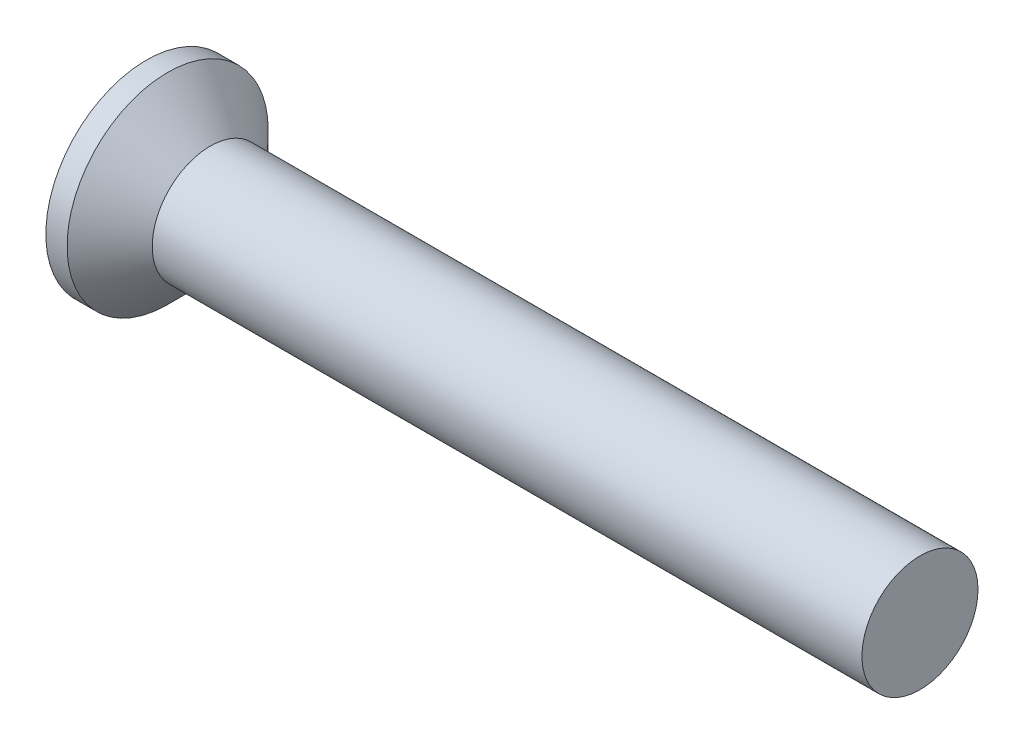
ISO-10303-21;
HEADER;
FILE_DESCRIPTION(('STEP AP214'),'2;1');
FILE_NAME('part.step','',(''),(''),'','','');
FILE_SCHEMA(('AUTOMOTIVE_DESIGN { 1 0 10303 214 1 1 1 1 }'));
ENDSEC;
DATA;
#1=APPLICATION_CONTEXT('core data for automotive mechanical design processes');
#2=APPLICATION_PROTOCOL_DEFINITION('international standard','automotive_design',2000,#1);
#3=PRODUCT_CONTEXT('',#1,'mechanical');
#4=PRODUCT('Part','Part','',(#3));
#5=PRODUCT_RELATED_PRODUCT_CATEGORY('part','',(#4));
#6=PRODUCT_DEFINITION_FORMATION('','',#4);
#7=PRODUCT_DEFINITION_CONTEXT('part definition',#1,'design');
#8=PRODUCT_DEFINITION('design','',#6,#7);
#9=PRODUCT_DEFINITION_SHAPE('','',#8);
#10=(LENGTH_UNIT() NAMED_UNIT(*) SI_UNIT(.MILLI.,.METRE.));
#11=(NAMED_UNIT(*) PLANE_ANGLE_UNIT() SI_UNIT($,.RADIAN.));
#12=(NAMED_UNIT(*) SI_UNIT($,.STERADIAN.) SOLID_ANGLE_UNIT());
#13=UNCERTAINTY_MEASURE_WITH_UNIT(LENGTH_MEASURE(1.E-05),#10,'distance_accuracy_value','');
#14=(GEOMETRIC_REPRESENTATION_CONTEXT(3) GLOBAL_UNCERTAINTY_ASSIGNED_CONTEXT((#13)) GLOBAL_UNIT_ASSIGNED_CONTEXT((#10,
#11,#12)) REPRESENTATION_CONTEXT('',''));
#15=CARTESIAN_POINT('',(0.,0.,0.));
#16=DIRECTION('',(0.,0.,1.));
#17=DIRECTION('',(1.,0.,0.));
#18=AXIS2_PLACEMENT_3D('',#15,#16,#17);
#19=CARTESIAN_POINT('',(0.,2.59999999999999,0.));
#20=DIRECTION('',(-1.,0.,0.));
#21=DIRECTION('',(0.,0.,1.));
#22=AXIS2_PLACEMENT_3D('',#19,#20,#21);
#23=PLANE('',#22);
#24=CARTESIAN_POINT('',(0.,0.,0.));
#25=DIRECTION('',(1.,0.,0.));
#26=DIRECTION('',(0.,0.,-1.));
#27=AXIS2_PLACEMENT_3D('',#24,#25,#26);
#28=CIRCLE('',#27,2.59999999999999);
#29=CARTESIAN_POINT('',(0.,0.,-2.59999999999999));
#30=VERTEX_POINT('',#29);
#31=EDGE_CURVE('E188',#30,#30,#28,.T.);
#32=ORIENTED_EDGE('',*,*,#31,.F.);
#33=EDGE_LOOP('',(#32));
#34=FACE_BOUND('',#33,.T.);
#35=DIRECTION('',(0.,1.,0.));
#36=VECTOR('',#35,1.);
#37=CARTESIAN_POINT('',(0.,-0.32,-0.32));
#38=LINE('',#37,#36);
#39=CARTESIAN_POINT('',(0.,-1.6,-0.32));
#40=VERTEX_POINT('',#39);
#41=CARTESIAN_POINT('',(0.,-0.62,-0.32));
#42=VERTEX_POINT('',#41);
#43=EDGE_CURVE('E314',#40,#42,#38,.T.);
#44=ORIENTED_EDGE('',*,*,#43,.T.);
#45=CARTESIAN_POINT('',(0.,-0.62,-0.62));
#46=DIRECTION('',(-1.,0.,0.));
#47=DIRECTION('',(0.,0.,1.));
#48=AXIS2_PLACEMENT_3D('',#45,#46,#47);
#49=CIRCLE('',#48,0.3);
#50=CARTESIAN_POINT('',(0.,-0.32,-0.62));
#51=VERTEX_POINT('',#50);
#52=EDGE_CURVE('E193',#42,#51,#49,.T.);
#53=ORIENTED_EDGE('',*,*,#52,.T.);
#54=DIRECTION('',(0.,0.,-1.));
#55=VECTOR('',#54,1.);
#56=CARTESIAN_POINT('',(0.,-0.32,-0.32));
#57=LINE('',#56,#55);
#58=CARTESIAN_POINT('',(0.,-0.32,-1.6));
#59=VERTEX_POINT('',#58);
#60=EDGE_CURVE('E316',#51,#59,#57,.T.);
#61=ORIENTED_EDGE('',*,*,#60,.T.);
#62=DIRECTION('',(0.,1.,0.));
#63=VECTOR('',#62,1.);
#64=CARTESIAN_POINT('',(0.,0.32,-1.6));
#65=LINE('',#64,#63);
#66=CARTESIAN_POINT('',(0.,0.32,-1.6));
#67=VERTEX_POINT('',#66);
#68=EDGE_CURVE('E318',#59,#67,#65,.T.);
#69=ORIENTED_EDGE('',*,*,#68,.T.);
#70=DIRECTION('',(0.,0.,1.));
#71=VECTOR('',#70,1.);
#72=CARTESIAN_POINT('',(0.,0.32,-0.32));
#73=LINE('',#72,#71);
#74=CARTESIAN_POINT('',(0.,0.32,-0.62));
#75=VERTEX_POINT('',#74);
#76=EDGE_CURVE('E321',#67,#75,#73,.T.);
#77=ORIENTED_EDGE('',*,*,#76,.T.);
#78=CARTESIAN_POINT('',(0.,0.62,-0.62));
#79=DIRECTION('',(-1.,0.,0.));
#80=DIRECTION('',(0.,0.,1.));
#81=AXIS2_PLACEMENT_3D('',#78,#79,#80);
#82=CIRCLE('',#81,0.3);
#83=CARTESIAN_POINT('',(0.,0.62,-0.32));
#84=VERTEX_POINT('',#83);
#85=EDGE_CURVE('E191',#75,#84,#82,.T.);
#86=ORIENTED_EDGE('',*,*,#85,.T.);
#87=DIRECTION('',(0.,1.,0.));
#88=VECTOR('',#87,1.);
#89=CARTESIAN_POINT('',(0.,0.32,-0.32));
#90=LINE('',#89,#88);
#91=CARTESIAN_POINT('',(0.,1.6,-0.32));
#92=VERTEX_POINT('',#91);
#93=EDGE_CURVE('E324',#84,#92,#90,.T.);
#94=ORIENTED_EDGE('',*,*,#93,.T.);
#95=DIRECTION('',(0.,0.,1.));
#96=VECTOR('',#95,1.);
#97=CARTESIAN_POINT('',(0.,1.6,-0.32));
#98=LINE('',#97,#96);
#99=CARTESIAN_POINT('',(0.,1.6,0.32));
#100=VERTEX_POINT('',#99);
#101=EDGE_CURVE('E326',#92,#100,#98,.T.);
#102=ORIENTED_EDGE('',*,*,#101,.T.);
#103=DIRECTION('',(0.,-1.,0.));
#104=VECTOR('',#103,1.);
#105=CARTESIAN_POINT('',(0.,0.32,0.32));
#106=LINE('',#105,#104);
#107=CARTESIAN_POINT('',(0.,0.62,0.32));
#108=VERTEX_POINT('',#107);
#109=EDGE_CURVE('E329',#100,#108,#106,.T.);
#110=ORIENTED_EDGE('',*,*,#109,.T.);
#111=CARTESIAN_POINT('',(0.,0.62,0.62));
#112=DIRECTION('',(-1.,0.,0.));
#113=DIRECTION('',(0.,0.,1.));
#114=AXIS2_PLACEMENT_3D('',#111,#112,#113);
#115=CIRCLE('',#114,0.3);
#116=CARTESIAN_POINT('',(0.,0.32,0.62));
#117=VERTEX_POINT('',#116);
#118=EDGE_CURVE('E156',#108,#117,#115,.T.);
#119=ORIENTED_EDGE('',*,*,#118,.T.);
#120=DIRECTION('',(0.,0.,1.));
#121=VECTOR('',#120,1.);
#122=CARTESIAN_POINT('',(0.,0.32,0.32));
#123=LINE('',#122,#121);
#124=CARTESIAN_POINT('',(0.,0.32,1.6));
#125=VERTEX_POINT('',#124);
#126=EDGE_CURVE('E150',#117,#125,#123,.T.);
#127=ORIENTED_EDGE('',*,*,#126,.T.);
#128=DIRECTION('',(0.,-1.,0.));
#129=VECTOR('',#128,1.);
#130=CARTESIAN_POINT('',(0.,0.32,1.6));
#131=LINE('',#130,#129);
#132=CARTESIAN_POINT('',(0.,-0.32,1.6));
#133=VERTEX_POINT('',#132);
#134=EDGE_CURVE('E154',#125,#133,#131,.T.);
#135=ORIENTED_EDGE('',*,*,#134,.T.);
#136=DIRECTION('',(0.,0.,-1.));
#137=VECTOR('',#136,1.);
#138=CARTESIAN_POINT('',(0.,-0.32,0.32));
#139=LINE('',#138,#137);
#140=CARTESIAN_POINT('',(0.,-0.32,0.62));
#141=VERTEX_POINT('',#140);
#142=EDGE_CURVE('E168',#133,#141,#139,.T.);
#143=ORIENTED_EDGE('',*,*,#142,.T.);
#144=CARTESIAN_POINT('',(0.,-0.62,0.62));
#145=DIRECTION('',(-1.,0.,0.));
#146=DIRECTION('',(0.,0.,1.));
#147=AXIS2_PLACEMENT_3D('',#144,#145,#146);
#148=CIRCLE('',#147,0.3);
#149=CARTESIAN_POINT('',(0.,-0.62,0.32));
#150=VERTEX_POINT('',#149);
#151=EDGE_CURVE('E187',#141,#150,#148,.T.);
#152=ORIENTED_EDGE('',*,*,#151,.T.);
#153=DIRECTION('',(0.,-1.,0.));
#154=VECTOR('',#153,1.);
#155=CARTESIAN_POINT('',(0.,-0.32,0.32));
#156=LINE('',#155,#154);
#157=CARTESIAN_POINT('',(0.,-1.6,0.319999999999999));
#158=VERTEX_POINT('',#157);
#159=EDGE_CURVE('E309',#150,#158,#156,.T.);
#160=ORIENTED_EDGE('',*,*,#159,.T.);
#161=DIRECTION('',(0.,0.,-1.));
#162=VECTOR('',#161,1.);
#163=CARTESIAN_POINT('',(0.,-1.6,-0.32));
#164=LINE('',#163,#162);
#165=EDGE_CURVE('E311',#158,#40,#164,.T.);
#166=ORIENTED_EDGE('',*,*,#165,.T.);
#167=EDGE_LOOP('',(#44,#53,#61,#69,#77,#86,#94,#102,#110,#119,#127,#135,#143,#152,#160,#166));
#168=FACE_BOUND('',#167,.T.);
#169=ADVANCED_FACE('F37',(#34,#168),#23,.T.);
#170=CARTESIAN_POINT('',(20.,1.5,0.));
#171=DIRECTION('',(1.,0.,0.));
#172=DIRECTION('',(0.,0.,-1.));
#173=AXIS2_PLACEMENT_3D('',#170,#171,#172);
#174=PLANE('',#173);
#175=CARTESIAN_POINT('',(20.,0.,0.));
#176=DIRECTION('',(1.,0.,0.));
#177=DIRECTION('',(0.,0.,-1.));
#178=AXIS2_PLACEMENT_3D('',#175,#176,#177);
#179=CIRCLE('',#178,1.5);
#180=CARTESIAN_POINT('',(20.,0.,-1.5));
#181=VERTEX_POINT('',#180);
#182=EDGE_CURVE('E174',#181,#181,#179,.T.);
#183=ORIENTED_EDGE('',*,*,#182,.T.);
#184=EDGE_LOOP('',(#183));
#185=FACE_BOUND('',#184,.T.);
#186=ADVANCED_FACE('F241',(#185),#174,.T.);
#187=CARTESIAN_POINT('',(4.51581291088132,0.,0.));
#188=DIRECTION('',(1.,0.,0.));
#189=DIRECTION('',(0.,0.,-1.));
#190=AXIS2_PLACEMENT_3D('',#187,#188,#189);
#191=CYLINDRICAL_SURFACE('',#190,2.59999999999999);
#192=ORIENTED_EDGE('',*,*,#31,.T.);
#193=EDGE_LOOP('',(#192));
#194=FACE_BOUND('',#193,.T.);
#195=CARTESIAN_POINT('',(0.550000000000005,0.,0.));
#196=DIRECTION('',(1.,0.,0.));
#197=DIRECTION('',(0.,0.,-1.));
#198=AXIS2_PLACEMENT_3D('',#195,#196,#197);
#199=CIRCLE('',#198,2.59999999999999);
#200=CARTESIAN_POINT('',(0.550000000000005,0.,-2.59999999999999));
#201=VERTEX_POINT('',#200);
#202=EDGE_CURVE('E333',#201,#201,#199,.T.);
#203=ORIENTED_EDGE('',*,*,#202,.F.);
#204=EDGE_LOOP('',(#203));
#205=FACE_BOUND('',#204,.T.);
#206=ADVANCED_FACE('F247',(#194,#205),#191,.T.);
#207=CARTESIAN_POINT('',(1.65,0.,0.));
#208=DIRECTION('',(-1.,0.,0.));
#209=DIRECTION('',(0.,0.,1.));
#210=AXIS2_PLACEMENT_3D('',#207,#208,#209);
#211=CONICAL_SURFACE('',#210,1.49999999999999,0.78539816339745);
#212=ORIENTED_EDGE('',*,*,#202,.T.);
#213=EDGE_LOOP('',(#212));
#214=FACE_BOUND('',#213,.T.);
#215=CARTESIAN_POINT('',(1.65,0.,0.));
#216=DIRECTION('',(1.,0.,0.));
#217=DIRECTION('',(0.,0.,-1.));
#218=AXIS2_PLACEMENT_3D('',#215,#216,#217);
#219=CIRCLE('',#218,1.49999999999999);
#220=CARTESIAN_POINT('',(1.65,0.,-1.49999999999999));
#221=VERTEX_POINT('',#220);
#222=EDGE_CURVE('E177',#221,#221,#219,.T.);
#223=ORIENTED_EDGE('',*,*,#222,.F.);
#224=EDGE_LOOP('',(#223));
#225=FACE_BOUND('',#224,.T.);
#226=ADVANCED_FACE('F369',(#214,#225),#211,.T.);
#227=CARTESIAN_POINT('',(4.51581291088132,0.,0.));
#228=DIRECTION('',(1.,0.,0.));
#229=DIRECTION('',(0.,0.,-1.));
#230=AXIS2_PLACEMENT_3D('',#227,#228,#229);
#231=CYLINDRICAL_SURFACE('',#230,1.5);
#232=ORIENTED_EDGE('',*,*,#222,.T.);
#233=EDGE_LOOP('',(#232));
#234=FACE_BOUND('',#233,.T.);
#235=ORIENTED_EDGE('',*,*,#182,.F.);
#236=EDGE_LOOP('',(#235));
#237=FACE_BOUND('',#236,.T.);
#238=ADVANCED_FACE('F367',(#234,#237),#231,.T.);
#239=CARTESIAN_POINT('',(0.825,0.32,0.32));
#240=DIRECTION('',(0.,-1.,0.));
#241=DIRECTION('',(0.,0.,-1.));
#242=AXIS2_PLACEMENT_3D('',#239,#240,#241);
#243=PLANE('',#242);
#244=ORIENTED_EDGE('',*,*,#126,.F.);
#245=DIRECTION('',(-1.,0.,0.));
#246=VECTOR('',#245,1.);
#247=CARTESIAN_POINT('',(0.825,0.32,0.62));
#248=LINE('',#247,#246);
#249=CARTESIAN_POINT('',(0.825,0.32,0.62));
#250=VERTEX_POINT('',#249);
#251=EDGE_CURVE('E205',#117,#250,#248,.F.);
#252=ORIENTED_EDGE('',*,*,#251,.T.);
#253=DIRECTION('',(0.,0.,1.));
#254=VECTOR('',#253,1.);
#255=CARTESIAN_POINT('',(0.825,0.32,0.32));
#256=LINE('',#255,#254);
#257=CARTESIAN_POINT('',(0.825,0.32,1.12368602791856));
#258=VERTEX_POINT('',#257);
#259=EDGE_CURVE('E172',#250,#258,#256,.T.);
#260=ORIENTED_EDGE('',*,*,#259,.T.);
#261=DIRECTION('',(-0.866025403784438,0.,0.500000000000001));
#262=VECTOR('',#261,1.);
#263=CARTESIAN_POINT('',(0.,0.32,1.6));
#264=LINE('',#263,#262);
#265=EDGE_CURVE('E164',#258,#125,#264,.T.);
#266=ORIENTED_EDGE('',*,*,#265,.T.);
#267=EDGE_LOOP('',(#244,#252,#260,#266));
#268=FACE_BOUND('',#267,.T.);
#269=ADVANCED_FACE('F170',(#268),#243,.T.);
#270=CARTESIAN_POINT('',(0.,0.32,1.6));
#271=DIRECTION('',(-0.500000000000001,0.,-0.866025403784438));
#272=DIRECTION('',(-0.866025403784438,0.,0.500000000000001));
#273=AXIS2_PLACEMENT_3D('',#270,#271,#272);
#274=PLANE('',#273);
#275=ORIENTED_EDGE('',*,*,#134,.F.);
#276=ORIENTED_EDGE('',*,*,#265,.F.);
#277=DIRECTION('',(0.,-1.,0.));
#278=VECTOR('',#277,1.);
#279=CARTESIAN_POINT('',(0.825,0.32,1.12368602791856));
#280=LINE('',#279,#278);
#281=CARTESIAN_POINT('',(0.825,-0.32,1.12368602791856));
#282=VERTEX_POINT('',#281);
#283=EDGE_CURVE('E183',#258,#282,#280,.T.);
#284=ORIENTED_EDGE('',*,*,#283,.T.);
#285=DIRECTION('',(-0.866025403784438,0.,0.500000000000001));
#286=VECTOR('',#285,1.);
#287=CARTESIAN_POINT('',(1.17300625842204,-0.32,0.922764520938917));
#288=LINE('',#287,#286);
#289=EDGE_CURVE('E166',#282,#133,#288,.T.);
#290=ORIENTED_EDGE('',*,*,#289,.T.);
#291=EDGE_LOOP('',(#275,#276,#284,#290));
#292=FACE_BOUND('',#291,.T.);
#293=ADVANCED_FACE('F163',(#292),#274,.T.);
#294=CARTESIAN_POINT('',(0.825,-0.32,0.32));
#295=DIRECTION('',(0.,1.,0.));
#296=DIRECTION('',(0.,0.,1.));
#297=AXIS2_PLACEMENT_3D('',#294,#295,#296);
#298=PLANE('',#297);
#299=DIRECTION('',(0.,0.,-1.));
#300=VECTOR('',#299,1.);
#301=CARTESIAN_POINT('',(0.825,-0.32,0.32));
#302=LINE('',#301,#300);
#303=CARTESIAN_POINT('',(0.825,-0.32,0.62));
#304=VERTEX_POINT('',#303);
#305=EDGE_CURVE('E355',#282,#304,#302,.T.);
#306=ORIENTED_EDGE('',*,*,#305,.T.);
#307=DIRECTION('',(-1.,0.,0.));
#308=VECTOR('',#307,1.);
#309=CARTESIAN_POINT('',(0.825,-0.32,0.62));
#310=LINE('',#309,#308);
#311=EDGE_CURVE('E207',#304,#141,#310,.T.);
#312=ORIENTED_EDGE('',*,*,#311,.T.);
#313=ORIENTED_EDGE('',*,*,#142,.F.);
#314=ORIENTED_EDGE('',*,*,#289,.F.);
#315=EDGE_LOOP('',(#306,#312,#313,#314));
#316=FACE_BOUND('',#315,.T.);
#317=ADVANCED_FACE('F261',(#316),#298,.T.);
#318=CARTESIAN_POINT('',(0.825,-0.32,0.32));
#319=DIRECTION('',(0.,0.,-1.));
#320=DIRECTION('',(0.,1.,0.));
#321=AXIS2_PLACEMENT_3D('',#318,#319,#320);
#322=PLANE('',#321);
#323=ORIENTED_EDGE('',*,*,#159,.F.);
#324=DIRECTION('',(-1.,0.,0.));
#325=VECTOR('',#324,1.);
#326=CARTESIAN_POINT('',(0.825,-0.62,0.32));
#327=LINE('',#326,#325);
#328=CARTESIAN_POINT('',(0.825,-0.62,0.32));
#329=VERTEX_POINT('',#328);
#330=EDGE_CURVE('E52',#150,#329,#327,.F.);
#331=ORIENTED_EDGE('',*,*,#330,.T.);
#332=DIRECTION('',(0.,-1.,0.));
#333=VECTOR('',#332,1.);
#334=CARTESIAN_POINT('',(0.825,-0.32,0.32));
#335=LINE('',#334,#333);
#336=CARTESIAN_POINT('',(0.825,-1.12368602791856,0.319999999999999));
#337=VERTEX_POINT('',#336);
#338=EDGE_CURVE('E298',#329,#337,#335,.T.);
#339=ORIENTED_EDGE('',*,*,#338,.T.);
#340=DIRECTION('',(-0.866025403784438,-0.500000000000001,0.));
#341=VECTOR('',#340,1.);
#342=CARTESIAN_POINT('',(0.,-1.6,0.319999999999999));
#343=LINE('',#342,#341);
#344=EDGE_CURVE('E179',#337,#158,#343,.T.);
#345=ORIENTED_EDGE('',*,*,#344,.T.);
#346=EDGE_LOOP('',(#323,#331,#339,#345));
#347=FACE_BOUND('',#346,.T.);
#348=ADVANCED_FACE('F266',(#347),#322,.T.);
#349=CARTESIAN_POINT('',(0.,-1.6,-0.32));
#350=DIRECTION('',(-0.500000000000001,0.866025403784438,0.));
#351=DIRECTION('',(-0.866025403784438,-0.500000000000001,0.));
#352=AXIS2_PLACEMENT_3D('',#349,#350,#351);
#353=PLANE('',#352);
#354=ORIENTED_EDGE('',*,*,#165,.F.);
#355=ORIENTED_EDGE('',*,*,#344,.F.);
#356=DIRECTION('',(0.,0.,-1.));
#357=VECTOR('',#356,1.);
#358=CARTESIAN_POINT('',(0.825,-1.12368602791856,-0.32));
#359=LINE('',#358,#357);
#360=CARTESIAN_POINT('',(0.825,-1.12368602791856,-0.32));
#361=VERTEX_POINT('',#360);
#362=EDGE_CURVE('E294',#337,#361,#359,.T.);
#363=ORIENTED_EDGE('',*,*,#362,.T.);
#364=DIRECTION('',(-0.866025403784438,-0.500000000000001,0.));
#365=VECTOR('',#364,1.);
#366=CARTESIAN_POINT('',(1.17300625842204,-0.922764520938917,-0.32));
#367=LINE('',#366,#365);
#368=EDGE_CURVE('E293',#361,#40,#367,.T.);
#369=ORIENTED_EDGE('',*,*,#368,.T.);
#370=EDGE_LOOP('',(#354,#355,#363,#369));
#371=FACE_BOUND('',#370,.T.);
#372=ADVANCED_FACE('F262',(#371),#353,.T.);
#373=CARTESIAN_POINT('',(0.825,-0.32,-0.32));
#374=DIRECTION('',(0.,0.,1.));
#375=DIRECTION('',(0.,-1.,0.));
#376=AXIS2_PLACEMENT_3D('',#373,#374,#375);
#377=PLANE('',#376);
#378=DIRECTION('',(0.,1.,0.));
#379=VECTOR('',#378,1.);
#380=CARTESIAN_POINT('',(0.825,-0.32,-0.32));
#381=LINE('',#380,#379);
#382=CARTESIAN_POINT('',(0.825,-0.62,-0.32));
#383=VERTEX_POINT('',#382);
#384=EDGE_CURVE('E287',#361,#383,#381,.T.);
#385=ORIENTED_EDGE('',*,*,#384,.T.);
#386=DIRECTION('',(-1.,0.,0.));
#387=VECTOR('',#386,1.);
#388=CARTESIAN_POINT('',(0.825,-0.62,-0.32));
#389=LINE('',#388,#387);
#390=EDGE_CURVE('E184',#383,#42,#389,.T.);
#391=ORIENTED_EDGE('',*,*,#390,.T.);
#392=ORIENTED_EDGE('',*,*,#43,.F.);
#393=ORIENTED_EDGE('',*,*,#368,.F.);
#394=EDGE_LOOP('',(#385,#391,#392,#393));
#395=FACE_BOUND('',#394,.T.);
#396=ADVANCED_FACE('F265',(#395),#377,.T.);
#397=CARTESIAN_POINT('',(0.825,-0.32,-0.32));
#398=DIRECTION('',(0.,1.,0.));
#399=DIRECTION('',(0.,0.,1.));
#400=AXIS2_PLACEMENT_3D('',#397,#398,#399);
#401=PLANE('',#400);
#402=ORIENTED_EDGE('',*,*,#60,.F.);
#403=DIRECTION('',(-1.,0.,0.));
#404=VECTOR('',#403,1.);
#405=CARTESIAN_POINT('',(0.825,-0.32,-0.62));
#406=LINE('',#405,#404);
#407=CARTESIAN_POINT('',(0.825,-0.32,-0.62));
#408=VERTEX_POINT('',#407);
#409=EDGE_CURVE('E195',#51,#408,#406,.F.);
#410=ORIENTED_EDGE('',*,*,#409,.T.);
#411=DIRECTION('',(0.,0.,-1.));
#412=VECTOR('',#411,1.);
#413=CARTESIAN_POINT('',(0.825,-0.32,-0.32));
#414=LINE('',#413,#412);
#415=CARTESIAN_POINT('',(0.825,-0.32,-1.12368602791856));
#416=VERTEX_POINT('',#415);
#417=EDGE_CURVE('E289',#408,#416,#414,.T.);
#418=ORIENTED_EDGE('',*,*,#417,.T.);
#419=DIRECTION('',(-0.866025403784438,0.,-0.500000000000001));
#420=VECTOR('',#419,1.);
#421=CARTESIAN_POINT('',(0.,-0.32,-1.6));
#422=LINE('',#421,#420);
#423=EDGE_CURVE('E345',#416,#59,#422,.T.);
#424=ORIENTED_EDGE('',*,*,#423,.T.);
#425=EDGE_LOOP('',(#402,#410,#418,#424));
#426=FACE_BOUND('',#425,.T.);
#427=ADVANCED_FACE('F272',(#426),#401,.T.);
#428=CARTESIAN_POINT('',(0.,0.32,-1.6));
#429=DIRECTION('',(-0.500000000000001,0.,0.866025403784438));
#430=DIRECTION('',(0.866025403784438,0.,0.500000000000001));
#431=AXIS2_PLACEMENT_3D('',#428,#429,#430);
#432=PLANE('',#431);
#433=ORIENTED_EDGE('',*,*,#68,.F.);
#434=ORIENTED_EDGE('',*,*,#423,.F.);
#435=DIRECTION('',(0.,1.,0.));
#436=VECTOR('',#435,1.);
#437=CARTESIAN_POINT('',(0.825,0.32,-1.12368602791856));
#438=LINE('',#437,#436);
#439=CARTESIAN_POINT('',(0.825,0.32,-1.12368602791856));
#440=VERTEX_POINT('',#439);
#441=EDGE_CURVE('E296',#416,#440,#438,.T.);
#442=ORIENTED_EDGE('',*,*,#441,.T.);
#443=DIRECTION('',(-0.866025403784438,0.,-0.500000000000001));
#444=VECTOR('',#443,1.);
#445=CARTESIAN_POINT('',(1.17300625842204,0.32,-0.922764520938917));
#446=LINE('',#445,#444);
#447=EDGE_CURVE('E343',#440,#67,#446,.T.);
#448=ORIENTED_EDGE('',*,*,#447,.T.);
#449=EDGE_LOOP('',(#433,#434,#442,#448));
#450=FACE_BOUND('',#449,.T.);
#451=ADVANCED_FACE('F268',(#450),#432,.T.);
#452=CARTESIAN_POINT('',(0.825,0.32,-0.32));
#453=DIRECTION('',(0.,-1.,0.));
#454=DIRECTION('',(0.,0.,-1.));
#455=AXIS2_PLACEMENT_3D('',#452,#453,#454);
#456=PLANE('',#455);
#457=DIRECTION('',(0.,0.,1.));
#458=VECTOR('',#457,1.);
#459=CARTESIAN_POINT('',(0.825,0.32,-0.32));
#460=LINE('',#459,#458);
#461=CARTESIAN_POINT('',(0.825,0.32,-0.62));
#462=VERTEX_POINT('',#461);
#463=EDGE_CURVE('E303',#440,#462,#460,.T.);
#464=ORIENTED_EDGE('',*,*,#463,.T.);
#465=DIRECTION('',(-1.,0.,0.));
#466=VECTOR('',#465,1.);
#467=CARTESIAN_POINT('',(0.825,0.32,-0.62));
#468=LINE('',#467,#466);
#469=EDGE_CURVE('E197',#462,#75,#468,.T.);
#470=ORIENTED_EDGE('',*,*,#469,.T.);
#471=ORIENTED_EDGE('',*,*,#76,.F.);
#472=ORIENTED_EDGE('',*,*,#447,.F.);
#473=EDGE_LOOP('',(#464,#470,#471,#472));
#474=FACE_BOUND('',#473,.T.);
#475=ADVANCED_FACE('F271',(#474),#456,.T.);
#476=CARTESIAN_POINT('',(0.825,0.32,-0.32));
#477=DIRECTION('',(0.,0.,1.));
#478=DIRECTION('',(0.,-1.,0.));
#479=AXIS2_PLACEMENT_3D('',#476,#477,#478);
#480=PLANE('',#479);
#481=ORIENTED_EDGE('',*,*,#93,.F.);
#482=DIRECTION('',(-1.,0.,0.));
#483=VECTOR('',#482,1.);
#484=CARTESIAN_POINT('',(0.825,0.62,-0.32));
#485=LINE('',#484,#483);
#486=CARTESIAN_POINT('',(0.825,0.62,-0.32));
#487=VERTEX_POINT('',#486);
#488=EDGE_CURVE('E200',#84,#487,#485,.F.);
#489=ORIENTED_EDGE('',*,*,#488,.T.);
#490=DIRECTION('',(0.,1.,0.));
#491=VECTOR('',#490,1.);
#492=CARTESIAN_POINT('',(0.825,0.32,-0.32));
#493=LINE('',#492,#491);
#494=CARTESIAN_POINT('',(0.825,1.12368602791856,-0.32));
#495=VERTEX_POINT('',#494);
#496=EDGE_CURVE('E306',#487,#495,#493,.T.);
#497=ORIENTED_EDGE('',*,*,#496,.T.);
#498=DIRECTION('',(-0.866025403784438,0.500000000000001,0.));
#499=VECTOR('',#498,1.);
#500=CARTESIAN_POINT('',(0.,1.6,-0.32));
#501=LINE('',#500,#499);
#502=EDGE_CURVE('E339',#495,#92,#501,.T.);
#503=ORIENTED_EDGE('',*,*,#502,.T.);
#504=EDGE_LOOP('',(#481,#489,#497,#503));
#505=FACE_BOUND('',#504,.T.);
#506=ADVANCED_FACE('F257',(#505),#480,.T.);
#507=CARTESIAN_POINT('',(0.,1.6,-0.32));
#508=DIRECTION('',(-0.500000000000001,-0.866025403784438,0.));
#509=DIRECTION('',(0.866025403784438,-0.500000000000001,0.));
#510=AXIS2_PLACEMENT_3D('',#507,#508,#509);
#511=PLANE('',#510);
#512=ORIENTED_EDGE('',*,*,#101,.F.);
#513=ORIENTED_EDGE('',*,*,#502,.F.);
#514=DIRECTION('',(0.,0.,1.));
#515=VECTOR('',#514,1.);
#516=CARTESIAN_POINT('',(0.825,1.12368602791856,-0.32));
#517=LINE('',#516,#515);
#518=CARTESIAN_POINT('',(0.825,1.12368602791856,0.32));
#519=VERTEX_POINT('',#518);
#520=EDGE_CURVE('E227',#495,#519,#517,.T.);
#521=ORIENTED_EDGE('',*,*,#520,.T.);
#522=DIRECTION('',(-0.866025403784438,0.500000000000001,0.));
#523=VECTOR('',#522,1.);
#524=CARTESIAN_POINT('',(1.17300625842204,0.922764520938917,0.32));
#525=LINE('',#524,#523);
#526=EDGE_CURVE('E226',#519,#100,#525,.T.);
#527=ORIENTED_EDGE('',*,*,#526,.T.);
#528=EDGE_LOOP('',(#512,#513,#521,#527));
#529=FACE_BOUND('',#528,.T.);
#530=ADVANCED_FACE('F254',(#529),#511,.T.);
#531=CARTESIAN_POINT('',(0.825,0.32,0.32));
#532=DIRECTION('',(0.,0.,-1.));
#533=DIRECTION('',(0.,1.,0.));
#534=AXIS2_PLACEMENT_3D('',#531,#532,#533);
#535=PLANE('',#534);
#536=DIRECTION('',(0.,-1.,0.));
#537=VECTOR('',#536,1.);
#538=CARTESIAN_POINT('',(0.825,0.32,0.32));
#539=LINE('',#538,#537);
#540=CARTESIAN_POINT('',(0.825,0.62,0.32));
#541=VERTEX_POINT('',#540);
#542=EDGE_CURVE('E219',#519,#541,#539,.T.);
#543=ORIENTED_EDGE('',*,*,#542,.T.);
#544=DIRECTION('',(-1.,0.,0.));
#545=VECTOR('',#544,1.);
#546=CARTESIAN_POINT('',(0.825,0.62,0.32));
#547=LINE('',#546,#545);
#548=EDGE_CURVE('E202',#541,#108,#547,.T.);
#549=ORIENTED_EDGE('',*,*,#548,.T.);
#550=ORIENTED_EDGE('',*,*,#109,.F.);
#551=ORIENTED_EDGE('',*,*,#526,.F.);
#552=EDGE_LOOP('',(#543,#549,#550,#551));
#553=FACE_BOUND('',#552,.T.);
#554=ADVANCED_FACE('F224',(#553),#535,.T.);
#555=CARTESIAN_POINT('',(0.825,0.32,0.32));
#556=DIRECTION('',(1.,0.,0.));
#557=DIRECTION('',(0.,0.,-1.));
#558=AXIS2_PLACEMENT_3D('',#555,#556,#557);
#559=PLANE('',#558);
#560=ORIENTED_EDGE('',*,*,#259,.F.);
#561=CARTESIAN_POINT('',(0.825,0.62,0.62));
#562=DIRECTION('',(1.,0.,0.));
#563=DIRECTION('',(0.,0.,-1.));
#564=AXIS2_PLACEMENT_3D('',#561,#562,#563);
#565=CIRCLE('',#564,0.3);
#566=EDGE_CURVE('E45',#250,#541,#565,.T.);
#567=ORIENTED_EDGE('',*,*,#566,.T.);
#568=ORIENTED_EDGE('',*,*,#542,.F.);
#569=ORIENTED_EDGE('',*,*,#520,.F.);
#570=ORIENTED_EDGE('',*,*,#496,.F.);
#571=CARTESIAN_POINT('',(0.825,0.62,-0.62));
#572=DIRECTION('',(1.,0.,0.));
#573=DIRECTION('',(0.,0.,-1.));
#574=AXIS2_PLACEMENT_3D('',#571,#572,#573);
#575=CIRCLE('',#574,0.3);
#576=EDGE_CURVE('E213',#487,#462,#575,.T.);
#577=ORIENTED_EDGE('',*,*,#576,.T.);
#578=ORIENTED_EDGE('',*,*,#463,.F.);
#579=ORIENTED_EDGE('',*,*,#441,.F.);
#580=ORIENTED_EDGE('',*,*,#417,.F.);
#581=CARTESIAN_POINT('',(0.825,-0.62,-0.62));
#582=DIRECTION('',(1.,0.,0.));
#583=DIRECTION('',(0.,0.,-1.));
#584=AXIS2_PLACEMENT_3D('',#581,#582,#583);
#585=CIRCLE('',#584,0.3);
#586=EDGE_CURVE('E211',#408,#383,#585,.T.);
#587=ORIENTED_EDGE('',*,*,#586,.T.);
#588=ORIENTED_EDGE('',*,*,#384,.F.);
#589=ORIENTED_EDGE('',*,*,#362,.F.);
#590=ORIENTED_EDGE('',*,*,#338,.F.);
#591=CARTESIAN_POINT('',(0.825,-0.62,0.62));
#592=DIRECTION('',(1.,0.,0.));
#593=DIRECTION('',(0.,0.,-1.));
#594=AXIS2_PLACEMENT_3D('',#591,#592,#593);
#595=CIRCLE('',#594,0.3);
#596=EDGE_CURVE('E11',#329,#304,#595,.T.);
#597=ORIENTED_EDGE('',*,*,#596,.T.);
#598=ORIENTED_EDGE('',*,*,#305,.F.);
#599=ORIENTED_EDGE('',*,*,#283,.F.);
#600=EDGE_LOOP('',(#560,#567,#568,#569,#570,#577,#578,#579,#580,#587,#588,#589,#590,#597,#598,#599));
#601=FACE_BOUND('',#600,.T.);
#602=ADVANCED_FACE('F217',(#601),#559,.F.);
#603=CARTESIAN_POINT('',(0.825,-0.62,-0.62));
#604=DIRECTION('',(-1.,0.,0.));
#605=DIRECTION('',(0.,0.,1.));
#606=AXIS2_PLACEMENT_3D('',#603,#604,#605);
#607=CYLINDRICAL_SURFACE('',#606,0.3);
#608=ORIENTED_EDGE('',*,*,#586,.F.);
#609=ORIENTED_EDGE('',*,*,#409,.F.);
#610=ORIENTED_EDGE('',*,*,#52,.F.);
#611=ORIENTED_EDGE('',*,*,#390,.F.);
#612=EDGE_LOOP('',(#608,#609,#610,#611));
#613=FACE_BOUND('',#612,.T.);
#614=ADVANCED_FACE('F237',(#613),#607,.T.);
#615=CARTESIAN_POINT('',(0.825,0.62,-0.62));
#616=DIRECTION('',(-1.,0.,0.));
#617=DIRECTION('',(0.,0.,1.));
#618=AXIS2_PLACEMENT_3D('',#615,#616,#617);
#619=CYLINDRICAL_SURFACE('',#618,0.3);
#620=ORIENTED_EDGE('',*,*,#576,.F.);
#621=ORIENTED_EDGE('',*,*,#488,.F.);
#622=ORIENTED_EDGE('',*,*,#85,.F.);
#623=ORIENTED_EDGE('',*,*,#469,.F.);
#624=EDGE_LOOP('',(#620,#621,#622,#623));
#625=FACE_BOUND('',#624,.T.);
#626=ADVANCED_FACE('F231',(#625),#619,.T.);
#627=CARTESIAN_POINT('',(0.825,0.62,0.62));
#628=DIRECTION('',(-1.,0.,0.));
#629=DIRECTION('',(0.,0.,1.));
#630=AXIS2_PLACEMENT_3D('',#627,#628,#629);
#631=CYLINDRICAL_SURFACE('',#630,0.3);
#632=ORIENTED_EDGE('',*,*,#566,.F.);
#633=ORIENTED_EDGE('',*,*,#251,.F.);
#634=ORIENTED_EDGE('',*,*,#118,.F.);
#635=ORIENTED_EDGE('',*,*,#548,.F.);
#636=EDGE_LOOP('',(#632,#633,#634,#635));
#637=FACE_BOUND('',#636,.T.);
#638=ADVANCED_FACE('F229',(#637),#631,.T.);
#639=CARTESIAN_POINT('',(0.825,-0.62,0.62));
#640=DIRECTION('',(-1.,0.,0.));
#641=DIRECTION('',(0.,0.,1.));
#642=AXIS2_PLACEMENT_3D('',#639,#640,#641);
#643=CYLINDRICAL_SURFACE('',#642,0.3);
#644=ORIENTED_EDGE('',*,*,#596,.F.);
#645=ORIENTED_EDGE('',*,*,#330,.F.);
#646=ORIENTED_EDGE('',*,*,#151,.F.);
#647=ORIENTED_EDGE('',*,*,#311,.F.);
#648=EDGE_LOOP('',(#644,#645,#646,#647));
#649=FACE_BOUND('',#648,.T.);
#650=ADVANCED_FACE('F39',(#649),#643,.T.);
#651=CLOSED_SHELL('',(#169,#186,#206,#226,#238,#269,#293,#317,#348,#372,#396,#427,#451,#475,
#506,#530,#554,#602,#614,#626,#638,#650));
#652=MANIFOLD_SOLID_BREP('B2',#651);
#653=ADVANCED_BREP_SHAPE_REPRESENTATION('',(#18,#652),#14);
#654=SHAPE_DEFINITION_REPRESENTATION(#9,#653);
ENDSEC;
END-ISO-10303-21;
